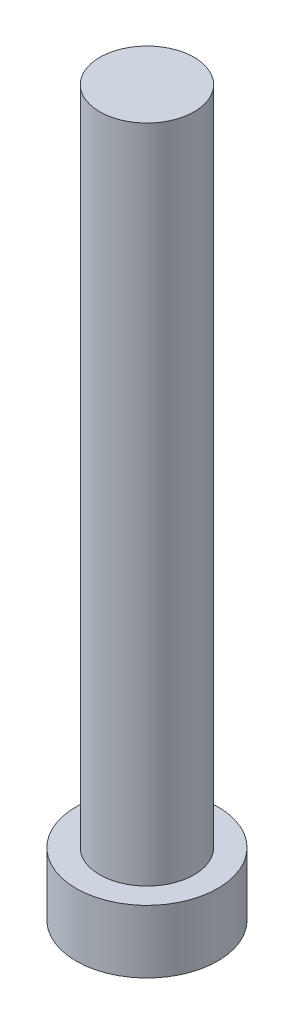
ISO-10303-21;
HEADER;
FILE_DESCRIPTION(('STEP AP214'),'2;1');
FILE_NAME('part.step','',(''),(''),'','','');
FILE_SCHEMA(('AUTOMOTIVE_DESIGN { 1 0 10303 214 1 1 1 1 }'));
ENDSEC;
DATA;
#1=APPLICATION_CONTEXT('core data for automotive mechanical design processes');
#2=APPLICATION_PROTOCOL_DEFINITION('international standard','automotive_design',2000,#1);
#3=PRODUCT_CONTEXT('',#1,'mechanical');
#4=PRODUCT('Part','Part','',(#3));
#5=PRODUCT_RELATED_PRODUCT_CATEGORY('part','',(#4));
#6=PRODUCT_DEFINITION_FORMATION('','',#4);
#7=PRODUCT_DEFINITION_CONTEXT('part definition',#1,'design');
#8=PRODUCT_DEFINITION('design','',#6,#7);
#9=PRODUCT_DEFINITION_SHAPE('','',#8);
#10=(LENGTH_UNIT() NAMED_UNIT(*) SI_UNIT(.MILLI.,.METRE.));
#11=(NAMED_UNIT(*) PLANE_ANGLE_UNIT() SI_UNIT($,.RADIAN.));
#12=(NAMED_UNIT(*) SI_UNIT($,.STERADIAN.) SOLID_ANGLE_UNIT());
#13=UNCERTAINTY_MEASURE_WITH_UNIT(LENGTH_MEASURE(1.E-05),#10,'distance_accuracy_value','');
#14=(GEOMETRIC_REPRESENTATION_CONTEXT(3) GLOBAL_UNCERTAINTY_ASSIGNED_CONTEXT((#13)) GLOBAL_UNIT_ASSIGNED_CONTEXT((#10,
#11,#12)) REPRESENTATION_CONTEXT('',''));
#15=CARTESIAN_POINT('',(0.,0.,0.));
#16=DIRECTION('',(0.,0.,1.));
#17=DIRECTION('',(1.,0.,0.));
#18=AXIS2_PLACEMENT_3D('',#15,#16,#17);
#19=CARTESIAN_POINT('',(0.,230.,0.));
#20=DIRECTION('',(0.,-1.,0.));
#21=DIRECTION('',(0.,0.,-1.));
#22=AXIS2_PLACEMENT_3D('',#19,#20,#21);
#23=CYLINDRICAL_SURFACE('',#22,15.);
#24=CARTESIAN_POINT('',(0.,20.,0.));
#25=DIRECTION('',(0.,1.,0.));
#26=DIRECTION('',(0.,0.,1.));
#27=AXIS2_PLACEMENT_3D('',#24,#25,#26);
#28=CIRCLE('',#27,15.);
#29=CARTESIAN_POINT('',(0.,20.,15.));
#30=VERTEX_POINT('',#29);
#31=EDGE_CURVE('E49',#30,#30,#28,.T.);
#32=ORIENTED_EDGE('',*,*,#31,.T.);
#33=EDGE_LOOP('',(#32));
#34=FACE_BOUND('',#33,.T.);
#35=CARTESIAN_POINT('',(0.,230.,0.));
#36=DIRECTION('',(0.,1.,0.));
#37=DIRECTION('',(0.,0.,1.));
#38=AXIS2_PLACEMENT_3D('',#35,#36,#37);
#39=CIRCLE('',#38,15.);
#40=CARTESIAN_POINT('',(0.,230.,15.));
#41=VERTEX_POINT('',#40);
#42=EDGE_CURVE('E10',#41,#41,#39,.T.);
#43=ORIENTED_EDGE('',*,*,#42,.F.);
#44=EDGE_LOOP('',(#43));
#45=FACE_BOUND('',#44,.T.);
#46=ADVANCED_FACE('F34',(#34,#45),#23,.T.);
#47=CARTESIAN_POINT('',(0.,230.,0.));
#48=DIRECTION('',(0.,1.,0.));
#49=DIRECTION('',(0.,0.,1.));
#50=AXIS2_PLACEMENT_3D('',#47,#48,#49);
#51=PLANE('',#50);
#52=ORIENTED_EDGE('',*,*,#42,.T.);
#53=EDGE_LOOP('',(#52));
#54=FACE_BOUND('',#53,.T.);
#55=ADVANCED_FACE('F59',(#54),#51,.T.);
#56=CARTESIAN_POINT('',(0.,20.,0.));
#57=DIRECTION('',(0.,1.,0.));
#58=DIRECTION('',(0.,0.,1.));
#59=AXIS2_PLACEMENT_3D('',#56,#57,#58);
#60=PLANE('',#59);
#61=CARTESIAN_POINT('',(0.,20.,0.));
#62=DIRECTION('',(0.,1.,0.));
#63=DIRECTION('',(0.,0.,1.));
#64=AXIS2_PLACEMENT_3D('',#61,#62,#63);
#65=CIRCLE('',#64,22.5);
#66=CARTESIAN_POINT('',(0.,20.,22.5));
#67=VERTEX_POINT('',#66);
#68=EDGE_CURVE('E40',#67,#67,#65,.T.);
#69=ORIENTED_EDGE('',*,*,#68,.T.);
#70=EDGE_LOOP('',(#69));
#71=FACE_BOUND('',#70,.T.);
#72=ORIENTED_EDGE('',*,*,#31,.F.);
#73=EDGE_LOOP('',(#72));
#74=FACE_BOUND('',#73,.T.);
#75=ADVANCED_FACE('F56',(#71,#74),#60,.T.);
#76=CARTESIAN_POINT('',(0.,20.,0.));
#77=DIRECTION('',(0.,-1.,0.));
#78=DIRECTION('',(0.,0.,-1.));
#79=AXIS2_PLACEMENT_3D('',#76,#77,#78);
#80=CYLINDRICAL_SURFACE('',#79,22.5);
#81=ORIENTED_EDGE('',*,*,#68,.F.);
#82=EDGE_LOOP('',(#81));
#83=FACE_BOUND('',#82,.T.);
#84=CARTESIAN_POINT('',(0.,0.,0.));
#85=DIRECTION('',(0.,1.,0.));
#86=DIRECTION('',(0.,0.,1.));
#87=AXIS2_PLACEMENT_3D('',#84,#85,#86);
#88=CIRCLE('',#87,22.5);
#89=CARTESIAN_POINT('',(0.,0.,22.5));
#90=VERTEX_POINT('',#89);
#91=EDGE_CURVE('E44',#90,#90,#88,.T.);
#92=ORIENTED_EDGE('',*,*,#91,.T.);
#93=EDGE_LOOP('',(#92));
#94=FACE_BOUND('',#93,.T.);
#95=ADVANCED_FACE('F58',(#83,#94),#80,.T.);
#96=CARTESIAN_POINT('',(0.,0.,0.));
#97=DIRECTION('',(0.,1.,0.));
#98=DIRECTION('',(0.,0.,1.));
#99=AXIS2_PLACEMENT_3D('',#96,#97,#98);
#100=PLANE('',#99);
#101=ORIENTED_EDGE('',*,*,#91,.F.);
#102=EDGE_LOOP('',(#101));
#103=FACE_BOUND('',#102,.T.);
#104=ADVANCED_FACE('F65',(#103),#100,.F.);
#105=CLOSED_SHELL('',(#46,#55,#75,#95,#104));
#106=MANIFOLD_SOLID_BREP('B2',#105);
#107=ADVANCED_BREP_SHAPE_REPRESENTATION('',(#18,#106),#14);
#108=SHAPE_DEFINITION_REPRESENTATION(#9,#107);
ENDSEC;
END-ISO-10303-21;
